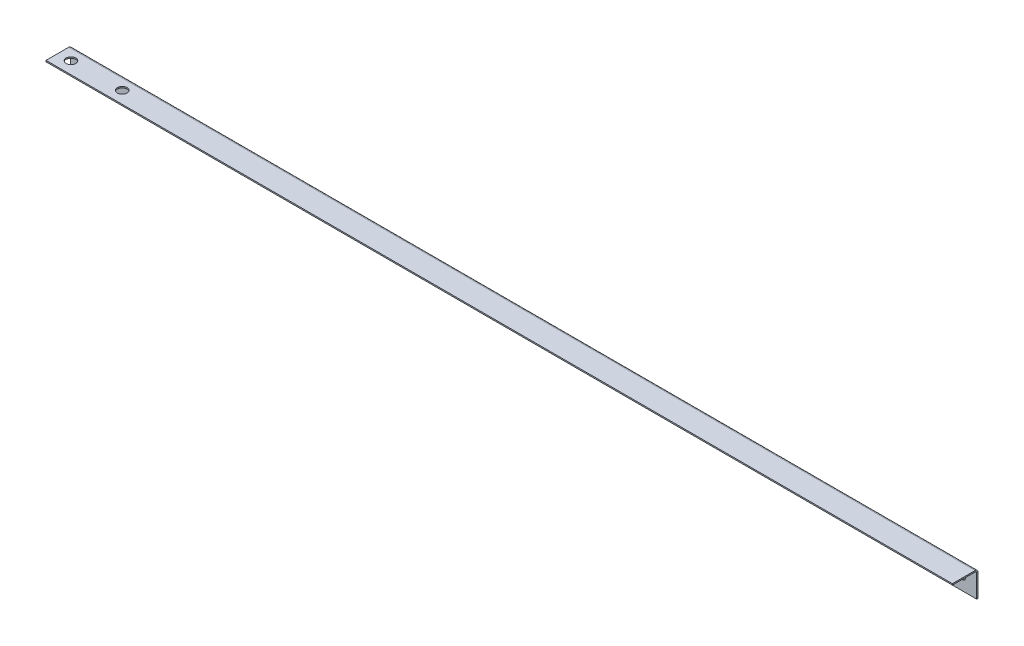
ISO-10303-21;
HEADER;
FILE_DESCRIPTION(('STEP AP214'),'2;1');
FILE_NAME('part.step','',(''),(''),'','','');
FILE_SCHEMA(('AUTOMOTIVE_DESIGN { 1 0 10303 214 1 1 1 1 }'));
ENDSEC;
DATA;
#1=APPLICATION_CONTEXT('core data for automotive mechanical design processes');
#2=APPLICATION_PROTOCOL_DEFINITION('international standard','automotive_design',2000,#1);
#3=PRODUCT_CONTEXT('',#1,'mechanical');
#4=PRODUCT('Part','Part','',(#3));
#5=PRODUCT_RELATED_PRODUCT_CATEGORY('part','',(#4));
#6=PRODUCT_DEFINITION_FORMATION('','',#4);
#7=PRODUCT_DEFINITION_CONTEXT('part definition',#1,'design');
#8=PRODUCT_DEFINITION('design','',#6,#7);
#9=PRODUCT_DEFINITION_SHAPE('','',#8);
#10=(LENGTH_UNIT() NAMED_UNIT(*) SI_UNIT(.MILLI.,.METRE.));
#11=(NAMED_UNIT(*) PLANE_ANGLE_UNIT() SI_UNIT($,.RADIAN.));
#12=(NAMED_UNIT(*) SI_UNIT($,.STERADIAN.) SOLID_ANGLE_UNIT());
#13=UNCERTAINTY_MEASURE_WITH_UNIT(LENGTH_MEASURE(1.E-05),#10,'distance_accuracy_value','');
#14=(GEOMETRIC_REPRESENTATION_CONTEXT(3) GLOBAL_UNCERTAINTY_ASSIGNED_CONTEXT((#13)) GLOBAL_UNIT_ASSIGNED_CONTEXT((#10,
#11,#12)) REPRESENTATION_CONTEXT('',''));
#15=CARTESIAN_POINT('',(0.,0.,0.));
#16=DIRECTION('',(0.,0.,1.));
#17=DIRECTION('',(1.,0.,0.));
#18=AXIS2_PLACEMENT_3D('',#15,#16,#17);
#19=CARTESIAN_POINT('',(-917.944287729196,82.8577402699222,-2.));
#20=DIRECTION('',(-1.,0.,0.));
#21=DIRECTION('',(0.,0.,1.));
#22=AXIS2_PLACEMENT_3D('',#19,#20,#21);
#23=PLANE('',#22);
#24=DIRECTION('',(0.,-1.,0.));
#25=VECTOR('',#24,1.);
#26=CARTESIAN_POINT('',(-917.944287729196,82.8577402699222,0.));
#27=LINE('',#26,#25);
#28=CARTESIAN_POINT('',(-917.944287729196,78.3577402699223,0.));
#29=VERTEX_POINT('',#28);
#30=CARTESIAN_POINT('',(-917.944287729196,42.8577402699222,0.));
#31=VERTEX_POINT('',#30);
#32=EDGE_CURVE('E311',#29,#31,#27,.T.);
#33=ORIENTED_EDGE('',*,*,#32,.F.);
#34=DIRECTION('',(0.,0.,-1.));
#35=VECTOR('',#34,1.);
#36=CARTESIAN_POINT('',(-917.944287729196,78.3577402699223,0.));
#37=LINE('',#36,#35);
#38=CARTESIAN_POINT('',(-917.944287729196,78.3577402699222,-1.99999999999999));
#39=VERTEX_POINT('',#38);
#40=EDGE_CURVE('E227',#29,#39,#37,.T.);
#41=ORIENTED_EDGE('',*,*,#40,.T.);
#42=DIRECTION('',(0.,-1.,0.));
#43=VECTOR('',#42,1.);
#44=CARTESIAN_POINT('',(-917.944287729196,82.8577402699222,-2.));
#45=LINE('',#44,#43);
#46=CARTESIAN_POINT('',(-917.944287729196,42.8577402699222,-2.));
#47=VERTEX_POINT('',#46);
#48=EDGE_CURVE('E303',#39,#47,#45,.T.);
#49=ORIENTED_EDGE('',*,*,#48,.T.);
#50=DIRECTION('',(0.,0.,1.));
#51=VECTOR('',#50,1.);
#52=CARTESIAN_POINT('',(-917.944287729196,42.8577402699222,-2.));
#53=LINE('',#52,#51);
#54=EDGE_CURVE('E65',#47,#31,#53,.T.);
#55=ORIENTED_EDGE('',*,*,#54,.T.);
#56=EDGE_LOOP('',(#33,#41,#49,#55));
#57=FACE_BOUND('',#56,.T.);
#58=ADVANCED_FACE('F61',(#57),#23,.T.);
#59=CARTESIAN_POINT('',(0.,0.,-2.));
#60=DIRECTION('',(0.,0.,-1.));
#61=DIRECTION('',(-1.,0.,0.));
#62=AXIS2_PLACEMENT_3D('',#59,#60,#61);
#63=PLANE('',#62);
#64=CARTESIAN_POINT('',(374.555712270804,62.8577402699224,-2.));
#65=DIRECTION('',(0.,0.,1.));
#66=DIRECTION('',(1.,0.,0.));
#67=AXIS2_PLACEMENT_3D('',#64,#65,#66);
#68=CIRCLE('',#67,4.99999999999999);
#69=CARTESIAN_POINT('',(374.555712270804,57.8577402699224,-2.));
#70=VERTEX_POINT('',#69);
#71=CARTESIAN_POINT('',(374.555712270804,67.8577402699224,-2.));
#72=VERTEX_POINT('',#71);
#73=EDGE_CURVE('E238',#70,#72,#68,.T.);
#74=ORIENTED_EDGE('',*,*,#73,.T.);
#75=DIRECTION('',(-1.,0.,0.));
#76=VECTOR('',#75,1.);
#77=CARTESIAN_POINT('',(374.555712270804,67.8577402699224,-2.));
#78=LINE('',#77,#76);
#79=CARTESIAN_POINT('',(359.555712270804,67.8577402699224,-2.));
#80=VERTEX_POINT('',#79);
#81=EDGE_CURVE('E241',#72,#80,#78,.T.);
#82=ORIENTED_EDGE('',*,*,#81,.T.);
#83=CARTESIAN_POINT('',(359.555712270804,62.8577402699224,-2.));
#84=DIRECTION('',(0.,0.,1.));
#85=DIRECTION('',(1.,0.,0.));
#86=AXIS2_PLACEMENT_3D('',#83,#84,#85);
#87=CIRCLE('',#86,5.);
#88=CARTESIAN_POINT('',(359.555712270804,57.8577402699224,-2.));
#89=VERTEX_POINT('',#88);
#90=EDGE_CURVE('E84',#80,#89,#87,.T.);
#91=ORIENTED_EDGE('',*,*,#90,.T.);
#92=DIRECTION('',(1.,0.,0.));
#93=VECTOR('',#92,1.);
#94=CARTESIAN_POINT('',(374.555712270804,57.8577402699224,-2.));
#95=LINE('',#94,#93);
#96=EDGE_CURVE('E246',#89,#70,#95,.T.);
#97=ORIENTED_EDGE('',*,*,#96,.T.);
#98=EDGE_LOOP('',(#74,#82,#91,#97));
#99=FACE_BOUND('',#98,.T.);
#100=CARTESIAN_POINT('',(474.555712270804,62.8577402699224,-2.));
#101=DIRECTION('',(0.,0.,1.));
#102=DIRECTION('',(1.,0.,0.));
#103=AXIS2_PLACEMENT_3D('',#100,#101,#102);
#104=CIRCLE('',#103,5.);
#105=CARTESIAN_POINT('',(474.555712270804,57.8577402699224,-2.));
#106=VERTEX_POINT('',#105);
#107=CARTESIAN_POINT('',(474.555712270804,67.8577402699224,-2.));
#108=VERTEX_POINT('',#107);
#109=EDGE_CURVE('E268',#106,#108,#104,.T.);
#110=ORIENTED_EDGE('',*,*,#109,.T.);
#111=DIRECTION('',(-1.,0.,0.));
#112=VECTOR('',#111,1.);
#113=CARTESIAN_POINT('',(474.555712270804,67.8577402699224,-2.));
#114=LINE('',#113,#112);
#115=CARTESIAN_POINT('',(459.555712270804,67.8577402699224,-2.));
#116=VERTEX_POINT('',#115);
#117=EDGE_CURVE('E271',#108,#116,#114,.T.);
#118=ORIENTED_EDGE('',*,*,#117,.T.);
#119=CARTESIAN_POINT('',(459.555712270804,62.8577402699224,-2.));
#120=DIRECTION('',(0.,0.,1.));
#121=DIRECTION('',(1.,0.,0.));
#122=AXIS2_PLACEMENT_3D('',#119,#120,#121);
#123=CIRCLE('',#122,5.);
#124=CARTESIAN_POINT('',(459.555712270804,57.8577402699224,-2.));
#125=VERTEX_POINT('',#124);
#126=EDGE_CURVE('E275',#116,#125,#123,.T.);
#127=ORIENTED_EDGE('',*,*,#126,.T.);
#128=DIRECTION('',(1.,0.,0.));
#129=VECTOR('',#128,1.);
#130=CARTESIAN_POINT('',(474.555712270804,57.8577402699224,-2.));
#131=LINE('',#130,#129);
#132=EDGE_CURVE('E278',#125,#106,#131,.T.);
#133=ORIENTED_EDGE('',*,*,#132,.T.);
#134=EDGE_LOOP('',(#110,#118,#127,#133));
#135=FACE_BOUND('',#134,.T.);
#136=ORIENTED_EDGE('',*,*,#48,.F.);
#137=DIRECTION('',(-1.,0.,0.));
#138=VECTOR('',#137,1.);
#139=CARTESIAN_POINT('',(-917.944287729196,78.3577402699222,-1.99999999999999));
#140=LINE('',#139,#138);
#141=CARTESIAN_POINT('',(497.055712270804,78.3577402699223,-2.));
#142=VERTEX_POINT('',#141);
#143=EDGE_CURVE('E177',#39,#142,#140,.F.);
#144=ORIENTED_EDGE('',*,*,#143,.T.);
#145=DIRECTION('',(0.,1.,0.));
#146=VECTOR('',#145,1.);
#147=CARTESIAN_POINT('',(497.055712270804,82.8577402699224,-2.));
#148=LINE('',#147,#146);
#149=CARTESIAN_POINT('',(497.055712270804,42.8577402699224,-2.));
#150=VERTEX_POINT('',#149);
#151=EDGE_CURVE('E300',#150,#142,#148,.T.);
#152=ORIENTED_EDGE('',*,*,#151,.F.);
#153=DIRECTION('',(1.,0.,0.));
#154=VECTOR('',#153,1.);
#155=CARTESIAN_POINT('',(497.055712270804,42.8577402699224,-2.));
#156=LINE('',#155,#154);
#157=EDGE_CURVE('E306',#47,#150,#156,.T.);
#158=ORIENTED_EDGE('',*,*,#157,.F.);
#159=EDGE_LOOP('',(#136,#144,#152,#158));
#160=FACE_BOUND('',#159,.T.);
#161=ADVANCED_FACE('F333',(#99,#135,#160),#63,.T.);
#162=CARTESIAN_POINT('',(0.,0.,0.));
#163=DIRECTION('',(0.,0.,-1.));
#164=DIRECTION('',(-1.,0.,0.));
#165=AXIS2_PLACEMENT_3D('',#162,#163,#164);
#166=PLANE('',#165);
#167=DIRECTION('',(-1.,0.,0.));
#168=VECTOR('',#167,1.);
#169=CARTESIAN_POINT('',(474.555712270804,67.8577402699224,0.));
#170=LINE('',#169,#168);
#171=CARTESIAN_POINT('',(474.555712270804,67.8577402699224,0.));
#172=VERTEX_POINT('',#171);
#173=CARTESIAN_POINT('',(459.555712270804,67.8577402699224,0.));
#174=VERTEX_POINT('',#173);
#175=EDGE_CURVE('E283',#172,#174,#170,.T.);
#176=ORIENTED_EDGE('',*,*,#175,.F.);
#177=CARTESIAN_POINT('',(474.555712270804,62.8577402699224,0.));
#178=DIRECTION('',(0.,0.,1.));
#179=DIRECTION('',(1.,0.,0.));
#180=AXIS2_PLACEMENT_3D('',#177,#178,#179);
#181=CIRCLE('',#180,5.);
#182=CARTESIAN_POINT('',(474.555712270804,57.8577402699224,0.));
#183=VERTEX_POINT('',#182);
#184=EDGE_CURVE('E261',#183,#172,#181,.T.);
#185=ORIENTED_EDGE('',*,*,#184,.F.);
#186=DIRECTION('',(1.,0.,0.));
#187=VECTOR('',#186,1.);
#188=CARTESIAN_POINT('',(474.555712270804,57.8577402699224,0.));
#189=LINE('',#188,#187);
#190=CARTESIAN_POINT('',(459.555712270804,57.8577402699224,0.));
#191=VERTEX_POINT('',#190);
#192=EDGE_CURVE('E272',#191,#183,#189,.T.);
#193=ORIENTED_EDGE('',*,*,#192,.F.);
#194=CARTESIAN_POINT('',(459.555712270804,62.8577402699224,0.));
#195=DIRECTION('',(0.,0.,1.));
#196=DIRECTION('',(1.,0.,0.));
#197=AXIS2_PLACEMENT_3D('',#194,#195,#196);
#198=CIRCLE('',#197,5.);
#199=EDGE_CURVE('E286',#174,#191,#198,.T.);
#200=ORIENTED_EDGE('',*,*,#199,.F.);
#201=EDGE_LOOP('',(#176,#185,#193,#200));
#202=FACE_BOUND('',#201,.T.);
#203=DIRECTION('',(-1.,0.,0.));
#204=VECTOR('',#203,1.);
#205=CARTESIAN_POINT('',(374.555712270804,67.8577402699224,0.));
#206=LINE('',#205,#204);
#207=CARTESIAN_POINT('',(374.555712270804,67.8577402699224,0.));
#208=VERTEX_POINT('',#207);
#209=CARTESIAN_POINT('',(359.555712270804,67.8577402699224,0.));
#210=VERTEX_POINT('',#209);
#211=EDGE_CURVE('E251',#208,#210,#206,.T.);
#212=ORIENTED_EDGE('',*,*,#211,.F.);
#213=CARTESIAN_POINT('',(374.555712270804,62.8577402699224,0.));
#214=DIRECTION('',(0.,0.,1.));
#215=DIRECTION('',(1.,0.,0.));
#216=AXIS2_PLACEMENT_3D('',#213,#214,#215);
#217=CIRCLE('',#216,4.99999999999999);
#218=CARTESIAN_POINT('',(374.555712270804,57.8577402699224,0.));
#219=VERTEX_POINT('',#218);
#220=EDGE_CURVE('E236',#219,#208,#217,.T.);
#221=ORIENTED_EDGE('',*,*,#220,.F.);
#222=DIRECTION('',(1.,0.,0.));
#223=VECTOR('',#222,1.);
#224=CARTESIAN_POINT('',(374.555712270804,57.8577402699224,0.));
#225=LINE('',#224,#223);
#226=CARTESIAN_POINT('',(359.555712270804,57.8577402699224,0.));
#227=VERTEX_POINT('',#226);
#228=EDGE_CURVE('E242',#227,#219,#225,.T.);
#229=ORIENTED_EDGE('',*,*,#228,.F.);
#230=CARTESIAN_POINT('',(359.555712270804,62.8577402699224,0.));
#231=DIRECTION('',(0.,0.,1.));
#232=DIRECTION('',(1.,0.,0.));
#233=AXIS2_PLACEMENT_3D('',#230,#231,#232);
#234=CIRCLE('',#233,5.);
#235=EDGE_CURVE('E254',#210,#227,#234,.T.);
#236=ORIENTED_EDGE('',*,*,#235,.F.);
#237=EDGE_LOOP('',(#212,#221,#229,#236));
#238=FACE_BOUND('',#237,.T.);
#239=DIRECTION('',(-1.,0.,0.));
#240=VECTOR('',#239,1.);
#241=CARTESIAN_POINT('',(-917.944287729196,78.3577402699223,0.));
#242=LINE('',#241,#240);
#243=CARTESIAN_POINT('',(497.055712270804,78.3577402699223,-1.14491749414469E-13));
#244=VERTEX_POINT('',#243);
#245=EDGE_CURVE('E231',#29,#244,#242,.F.);
#246=ORIENTED_EDGE('',*,*,#245,.F.);
#247=ORIENTED_EDGE('',*,*,#32,.T.);
#248=DIRECTION('',(1.,0.,0.));
#249=VECTOR('',#248,1.);
#250=CARTESIAN_POINT('',(497.055712270804,42.8577402699224,0.));
#251=LINE('',#250,#249);
#252=CARTESIAN_POINT('',(497.055712270804,42.8577402699224,0.));
#253=VERTEX_POINT('',#252);
#254=EDGE_CURVE('E304',#31,#253,#251,.T.);
#255=ORIENTED_EDGE('',*,*,#254,.T.);
#256=DIRECTION('',(0.,1.,0.));
#257=VECTOR('',#256,1.);
#258=CARTESIAN_POINT('',(497.055712270804,82.8577402699224,0.));
#259=LINE('',#258,#257);
#260=EDGE_CURVE('E293',#253,#244,#259,.T.);
#261=ORIENTED_EDGE('',*,*,#260,.T.);
#262=EDGE_LOOP('',(#246,#247,#255,#261));
#263=FACE_BOUND('',#262,.T.);
#264=ADVANCED_FACE('F317',(#202,#238,#263),#166,.F.);
#265=CARTESIAN_POINT('',(497.055712270804,82.8577402699224,-2.));
#266=DIRECTION('',(1.,0.,0.));
#267=DIRECTION('',(0.,0.,-1.));
#268=AXIS2_PLACEMENT_3D('',#265,#266,#267);
#269=PLANE('',#268);
#270=DIRECTION('',(0.,0.,-1.));
#271=VECTOR('',#270,1.);
#272=CARTESIAN_POINT('',(497.055712270804,78.3577402699223,-1.14491749414469E-13));
#273=LINE('',#272,#271);
#274=EDGE_CURVE('E234',#244,#142,#273,.T.);
#275=ORIENTED_EDGE('',*,*,#274,.F.);
#276=ORIENTED_EDGE('',*,*,#260,.F.);
#277=DIRECTION('',(0.,0.,1.));
#278=VECTOR('',#277,1.);
#279=CARTESIAN_POINT('',(497.055712270804,42.8577402699224,-2.));
#280=LINE('',#279,#278);
#281=EDGE_CURVE('E13',#150,#253,#280,.T.);
#282=ORIENTED_EDGE('',*,*,#281,.F.);
#283=ORIENTED_EDGE('',*,*,#151,.T.);
#284=EDGE_LOOP('',(#275,#276,#282,#283));
#285=FACE_BOUND('',#284,.T.);
#286=ADVANCED_FACE('F63',(#285),#269,.T.);
#287=CARTESIAN_POINT('',(497.055712270804,42.8577402699224,-2.));
#288=DIRECTION('',(0.,-1.,0.));
#289=DIRECTION('',(1.,0.,0.));
#290=AXIS2_PLACEMENT_3D('',#287,#288,#289);
#291=PLANE('',#290);
#292=ORIENTED_EDGE('',*,*,#254,.F.);
#293=ORIENTED_EDGE('',*,*,#54,.F.);
#294=ORIENTED_EDGE('',*,*,#157,.T.);
#295=ORIENTED_EDGE('',*,*,#281,.T.);
#296=EDGE_LOOP('',(#292,#293,#294,#295));
#297=FACE_BOUND('',#296,.T.);
#298=ADVANCED_FACE('F324',(#297),#291,.T.);
#299=CARTESIAN_POINT('',(474.555712270804,62.8577402699224,-2.));
#300=DIRECTION('',(0.,0.,1.));
#301=DIRECTION('',(1.,0.,0.));
#302=AXIS2_PLACEMENT_3D('',#299,#300,#301);
#303=CYLINDRICAL_SURFACE('',#302,5.);
#304=ORIENTED_EDGE('',*,*,#184,.T.);
#305=DIRECTION('',(0.,0.,1.));
#306=VECTOR('',#305,1.);
#307=CARTESIAN_POINT('',(474.555712270804,67.8577402699224,-2.));
#308=LINE('',#307,#306);
#309=EDGE_CURVE('E281',#108,#172,#308,.T.);
#310=ORIENTED_EDGE('',*,*,#309,.F.);
#311=ORIENTED_EDGE('',*,*,#109,.F.);
#312=DIRECTION('',(0.,0.,1.));
#313=VECTOR('',#312,1.);
#314=CARTESIAN_POINT('',(474.555712270804,57.8577402699224,-2.));
#315=LINE('',#314,#313);
#316=EDGE_CURVE('E291',#106,#183,#315,.T.);
#317=ORIENTED_EDGE('',*,*,#316,.T.);
#318=EDGE_LOOP('',(#304,#310,#311,#317));
#319=FACE_BOUND('',#318,.T.);
#320=ADVANCED_FACE('F392',(#319),#303,.F.);
#321=CARTESIAN_POINT('',(474.555712270804,57.8577402699224,-2.));
#322=DIRECTION('',(0.,-1.,0.));
#323=DIRECTION('',(1.,0.,0.));
#324=AXIS2_PLACEMENT_3D('',#321,#322,#323);
#325=PLANE('',#324);
#326=ORIENTED_EDGE('',*,*,#192,.T.);
#327=ORIENTED_EDGE('',*,*,#316,.F.);
#328=ORIENTED_EDGE('',*,*,#132,.F.);
#329=DIRECTION('',(0.,0.,1.));
#330=VECTOR('',#329,1.);
#331=CARTESIAN_POINT('',(459.555712270804,57.8577402699224,-2.));
#332=LINE('',#331,#330);
#333=EDGE_CURVE('E294',#125,#191,#332,.T.);
#334=ORIENTED_EDGE('',*,*,#333,.T.);
#335=EDGE_LOOP('',(#326,#327,#328,#334));
#336=FACE_BOUND('',#335,.T.);
#337=ADVANCED_FACE('F398',(#336),#325,.F.);
#338=CARTESIAN_POINT('',(459.555712270804,62.8577402699224,-2.));
#339=DIRECTION('',(0.,0.,1.));
#340=DIRECTION('',(1.,0.,0.));
#341=AXIS2_PLACEMENT_3D('',#338,#339,#340);
#342=CYLINDRICAL_SURFACE('',#341,5.);
#343=ORIENTED_EDGE('',*,*,#199,.T.);
#344=ORIENTED_EDGE('',*,*,#333,.F.);
#345=ORIENTED_EDGE('',*,*,#126,.F.);
#346=DIRECTION('',(0.,0.,1.));
#347=VECTOR('',#346,1.);
#348=CARTESIAN_POINT('',(459.555712270804,67.8577402699224,-2.));
#349=LINE('',#348,#347);
#350=EDGE_CURVE('E296',#116,#174,#349,.T.);
#351=ORIENTED_EDGE('',*,*,#350,.T.);
#352=EDGE_LOOP('',(#343,#344,#345,#351));
#353=FACE_BOUND('',#352,.T.);
#354=ADVANCED_FACE('F404',(#353),#342,.F.);
#355=CARTESIAN_POINT('',(474.555712270804,67.8577402699224,-2.));
#356=DIRECTION('',(0.,1.,0.));
#357=DIRECTION('',(0.,0.,1.));
#358=AXIS2_PLACEMENT_3D('',#355,#356,#357);
#359=PLANE('',#358);
#360=ORIENTED_EDGE('',*,*,#175,.T.);
#361=ORIENTED_EDGE('',*,*,#350,.F.);
#362=ORIENTED_EDGE('',*,*,#117,.F.);
#363=ORIENTED_EDGE('',*,*,#309,.T.);
#364=EDGE_LOOP('',(#360,#361,#362,#363));
#365=FACE_BOUND('',#364,.T.);
#366=ADVANCED_FACE('F400',(#365),#359,.F.);
#367=CARTESIAN_POINT('',(374.555712270804,62.8577402699224,-2.));
#368=DIRECTION('',(0.,0.,1.));
#369=DIRECTION('',(1.,0.,0.));
#370=AXIS2_PLACEMENT_3D('',#367,#368,#369);
#371=CYLINDRICAL_SURFACE('',#370,4.99999999999999);
#372=ORIENTED_EDGE('',*,*,#220,.T.);
#373=DIRECTION('',(0.,0.,1.));
#374=VECTOR('',#373,1.);
#375=CARTESIAN_POINT('',(374.555712270804,67.8577402699224,-2.));
#376=LINE('',#375,#374);
#377=EDGE_CURVE('E249',#72,#208,#376,.T.);
#378=ORIENTED_EDGE('',*,*,#377,.F.);
#379=ORIENTED_EDGE('',*,*,#73,.F.);
#380=DIRECTION('',(0.,0.,1.));
#381=VECTOR('',#380,1.);
#382=CARTESIAN_POINT('',(374.555712270804,57.8577402699224,-2.));
#383=LINE('',#382,#381);
#384=EDGE_CURVE('E259',#70,#219,#383,.T.);
#385=ORIENTED_EDGE('',*,*,#384,.T.);
#386=EDGE_LOOP('',(#372,#378,#379,#385));
#387=FACE_BOUND('',#386,.T.);
#388=ADVANCED_FACE('F403',(#387),#371,.F.);
#389=CARTESIAN_POINT('',(374.555712270804,57.8577402699224,-2.));
#390=DIRECTION('',(0.,-1.,0.));
#391=DIRECTION('',(1.,0.,0.));
#392=AXIS2_PLACEMENT_3D('',#389,#390,#391);
#393=PLANE('',#392);
#394=ORIENTED_EDGE('',*,*,#228,.T.);
#395=ORIENTED_EDGE('',*,*,#384,.F.);
#396=ORIENTED_EDGE('',*,*,#96,.F.);
#397=DIRECTION('',(0.,0.,1.));
#398=VECTOR('',#397,1.);
#399=CARTESIAN_POINT('',(359.555712270804,57.8577402699224,-2.));
#400=LINE('',#399,#398);
#401=EDGE_CURVE('E262',#89,#227,#400,.T.);
#402=ORIENTED_EDGE('',*,*,#401,.T.);
#403=EDGE_LOOP('',(#394,#395,#396,#402));
#404=FACE_BOUND('',#403,.T.);
#405=ADVANCED_FACE('F414',(#404),#393,.F.);
#406=CARTESIAN_POINT('',(359.555712270804,62.8577402699224,-2.));
#407=DIRECTION('',(0.,0.,1.));
#408=DIRECTION('',(1.,0.,0.));
#409=AXIS2_PLACEMENT_3D('',#406,#407,#408);
#410=CYLINDRICAL_SURFACE('',#409,5.);
#411=ORIENTED_EDGE('',*,*,#235,.T.);
#412=ORIENTED_EDGE('',*,*,#401,.F.);
#413=ORIENTED_EDGE('',*,*,#90,.F.);
#414=DIRECTION('',(0.,0.,1.));
#415=VECTOR('',#414,1.);
#416=CARTESIAN_POINT('',(359.555712270804,67.8577402699224,-2.));
#417=LINE('',#416,#415);
#418=EDGE_CURVE('E264',#80,#210,#417,.T.);
#419=ORIENTED_EDGE('',*,*,#418,.T.);
#420=EDGE_LOOP('',(#411,#412,#413,#419));
#421=FACE_BOUND('',#420,.T.);
#422=ADVANCED_FACE('F419',(#421),#410,.F.);
#423=CARTESIAN_POINT('',(374.555712270804,67.8577402699224,-2.));
#424=DIRECTION('',(0.,1.,0.));
#425=DIRECTION('',(0.,0.,1.));
#426=AXIS2_PLACEMENT_3D('',#423,#424,#425);
#427=PLANE('',#426);
#428=ORIENTED_EDGE('',*,*,#211,.T.);
#429=ORIENTED_EDGE('',*,*,#418,.F.);
#430=ORIENTED_EDGE('',*,*,#81,.F.);
#431=ORIENTED_EDGE('',*,*,#377,.T.);
#432=EDGE_LOOP('',(#428,#429,#430,#431));
#433=FACE_BOUND('',#432,.T.);
#434=ADVANCED_FACE('F416',(#433),#427,.F.);
#435=CARTESIAN_POINT('',(497.055712270804,78.3577402699223,2.49999999999997));
#436=DIRECTION('',(1.,0.,0.));
#437=DIRECTION('',(0.,0.,-1.));
#438=AXIS2_PLACEMENT_3D('',#435,#436,#437);
#439=PLANE('',#438);
#440=DIRECTION('',(0.,1.,0.));
#441=VECTOR('',#440,1.);
#442=CARTESIAN_POINT('',(497.055712270804,82.8577402699224,2.49999999999998));
#443=LINE('',#442,#441);
#444=CARTESIAN_POINT('',(497.055712270804,80.8577402699224,2.49999999999996));
#445=VERTEX_POINT('',#444);
#446=CARTESIAN_POINT('',(497.055712270804,82.8577402699224,2.49999999999995));
#447=VERTEX_POINT('',#446);
#448=EDGE_CURVE('E222',#445,#447,#443,.T.);
#449=ORIENTED_EDGE('',*,*,#448,.F.);
#450=CARTESIAN_POINT('',(497.055712270804,78.3577402699223,2.49999999999997));
#451=DIRECTION('',(-1.,0.,0.));
#452=DIRECTION('',(0.,0.,1.));
#453=AXIS2_PLACEMENT_3D('',#450,#451,#452);
#454=CIRCLE('',#453,2.50000000000009);
#455=EDGE_CURVE('E180',#244,#445,#454,.F.);
#456=ORIENTED_EDGE('',*,*,#455,.F.);
#457=ORIENTED_EDGE('',*,*,#274,.T.);
#458=CARTESIAN_POINT('',(497.055712270804,78.3577402699223,2.49999999999997));
#459=DIRECTION('',(-1.,0.,0.));
#460=DIRECTION('',(0.,0.,1.));
#461=AXIS2_PLACEMENT_3D('',#458,#459,#460);
#462=CIRCLE('',#461,4.50000000000009);
#463=EDGE_CURVE('E76',#142,#447,#462,.F.);
#464=ORIENTED_EDGE('',*,*,#463,.T.);
#465=EDGE_LOOP('',(#449,#456,#457,#464));
#466=FACE_BOUND('',#465,.T.);
#467=ADVANCED_FACE('F330',(#466),#439,.T.);
#468=CARTESIAN_POINT('',(-917.944287729196,78.3577402699223,2.50000000000009));
#469=DIRECTION('',(1.,0.,0.));
#470=DIRECTION('',(0.,0.,-1.));
#471=AXIS2_PLACEMENT_3D('',#468,#469,#470);
#472=PLANE('',#471);
#473=CARTESIAN_POINT('',(-917.944287729196,78.3577402699223,2.50000000000009));
#474=DIRECTION('',(-1.,0.,0.));
#475=DIRECTION('',(0.,0.,1.));
#476=AXIS2_PLACEMENT_3D('',#473,#474,#475);
#477=CIRCLE('',#476,2.50000000000009);
#478=CARTESIAN_POINT('',(-917.944287729196,80.8577402699224,2.50000000000008));
#479=VERTEX_POINT('',#478);
#480=EDGE_CURVE('E187',#479,#29,#477,.T.);
#481=ORIENTED_EDGE('',*,*,#480,.F.);
#482=DIRECTION('',(0.,1.,0.));
#483=VECTOR('',#482,1.);
#484=CARTESIAN_POINT('',(-917.944287729196,80.8577402699223,2.50000000000006));
#485=LINE('',#484,#483);
#486=CARTESIAN_POINT('',(-917.944287729196,82.8577402699223,2.50000000000005));
#487=VERTEX_POINT('',#486);
#488=EDGE_CURVE('E184',#479,#487,#485,.T.);
#489=ORIENTED_EDGE('',*,*,#488,.T.);
#490=CARTESIAN_POINT('',(-917.944287729196,78.3577402699223,2.50000000000009));
#491=DIRECTION('',(-1.,0.,0.));
#492=DIRECTION('',(0.,0.,1.));
#493=AXIS2_PLACEMENT_3D('',#490,#491,#492);
#494=CIRCLE('',#493,4.50000000000009);
#495=EDGE_CURVE('E171',#487,#39,#494,.T.);
#496=ORIENTED_EDGE('',*,*,#495,.T.);
#497=ORIENTED_EDGE('',*,*,#40,.F.);
#498=EDGE_LOOP('',(#481,#489,#496,#497));
#499=FACE_BOUND('',#498,.T.);
#500=ADVANCED_FACE('F185',(#499),#472,.F.);
#501=CARTESIAN_POINT('',(-917.944287729196,78.3577402699223,2.50000000000009));
#502=DIRECTION('',(-1.,0.,0.));
#503=DIRECTION('',(0.,1.,0.));
#504=AXIS2_PLACEMENT_3D('',#501,#502,#503);
#505=CYLINDRICAL_SURFACE('',#504,4.50000000000009);
#506=ORIENTED_EDGE('',*,*,#143,.F.);
#507=ORIENTED_EDGE('',*,*,#495,.F.);
#508=DIRECTION('',(-1.,0.,0.));
#509=VECTOR('',#508,1.);
#510=CARTESIAN_POINT('',(0.,82.8577402699224,2.50000000000001));
#511=LINE('',#510,#509);
#512=EDGE_CURVE('E175',#447,#487,#511,.T.);
#513=ORIENTED_EDGE('',*,*,#512,.F.);
#514=ORIENTED_EDGE('',*,*,#463,.F.);
#515=EDGE_LOOP('',(#506,#507,#513,#514));
#516=FACE_BOUND('',#515,.T.);
#517=ADVANCED_FACE('F173',(#516),#505,.T.);
#518=CARTESIAN_POINT('',(-917.944287729196,78.3577402699223,2.50000000000009));
#519=DIRECTION('',(-1.,0.,0.));
#520=DIRECTION('',(0.,1.,0.));
#521=AXIS2_PLACEMENT_3D('',#518,#519,#520);
#522=CYLINDRICAL_SURFACE('',#521,2.50000000000009);
#523=ORIENTED_EDGE('',*,*,#245,.T.);
#524=ORIENTED_EDGE('',*,*,#455,.T.);
#525=DIRECTION('',(1.,0.,0.));
#526=VECTOR('',#525,1.);
#527=CARTESIAN_POINT('',(497.055712270804,80.8577402699224,2.49999999999999));
#528=LINE('',#527,#526);
#529=EDGE_CURVE('E192',#445,#479,#528,.F.);
#530=ORIENTED_EDGE('',*,*,#529,.T.);
#531=ORIENTED_EDGE('',*,*,#480,.T.);
#532=EDGE_LOOP('',(#523,#524,#530,#531));
#533=FACE_BOUND('',#532,.T.);
#534=ADVANCED_FACE('F336',(#533),#522,.F.);
#535=CARTESIAN_POINT('',(-917.944287729196,82.8577402699222,0.));
#536=DIRECTION('',(-1.,0.,0.));
#537=DIRECTION('',(0.,-1.,0.));
#538=AXIS2_PLACEMENT_3D('',#535,#536,#537);
#539=PLANE('',#538);
#540=DIRECTION('',(0.,0.,-1.));
#541=VECTOR('',#540,1.);
#542=CARTESIAN_POINT('',(-917.944287729196,82.8577402699222,0.));
#543=LINE('',#542,#541);
#544=CARTESIAN_POINT('',(-917.944287729196,82.8577402699224,38.));
#545=VERTEX_POINT('',#544);
#546=EDGE_CURVE('E199',#545,#487,#543,.T.);
#547=ORIENTED_EDGE('',*,*,#546,.T.);
#548=ORIENTED_EDGE('',*,*,#488,.F.);
#549=DIRECTION('',(0.,0.,1.));
#550=VECTOR('',#549,1.);
#551=CARTESIAN_POINT('',(-917.944287729196,80.8577402699222,-3.02600562552891E-13));
#552=LINE('',#551,#550);
#553=CARTESIAN_POINT('',(-917.944287729196,80.8577402699224,38.));
#554=VERTEX_POINT('',#553);
#555=EDGE_CURVE('E215',#554,#479,#552,.F.);
#556=ORIENTED_EDGE('',*,*,#555,.F.);
#557=DIRECTION('',(0.,-1.,0.));
#558=VECTOR('',#557,1.);
#559=CARTESIAN_POINT('',(-917.944287729196,82.8577402699224,38.));
#560=LINE('',#559,#558);
#561=EDGE_CURVE('E204',#545,#554,#560,.T.);
#562=ORIENTED_EDGE('',*,*,#561,.F.);
#563=EDGE_LOOP('',(#547,#548,#556,#562));
#564=FACE_BOUND('',#563,.T.);
#565=ADVANCED_FACE('F203',(#564),#539,.T.);
#566=CARTESIAN_POINT('',(497.055712270804,82.8577402699226,38.));
#567=DIRECTION('',(1.,0.,0.));
#568=DIRECTION('',(0.,1.,0.));
#569=AXIS2_PLACEMENT_3D('',#566,#567,#568);
#570=PLANE('',#569);
#571=DIRECTION('',(0.,0.,-1.));
#572=VECTOR('',#571,1.);
#573=CARTESIAN_POINT('',(497.055712270804,80.8577402699224,-3.02600562552891E-13));
#574=LINE('',#573,#572);
#575=CARTESIAN_POINT('',(497.055712270804,80.8577402699226,38.));
#576=VERTEX_POINT('',#575);
#577=EDGE_CURVE('E201',#445,#576,#574,.F.);
#578=ORIENTED_EDGE('',*,*,#577,.F.);
#579=ORIENTED_EDGE('',*,*,#448,.T.);
#580=DIRECTION('',(0.,0.,1.));
#581=VECTOR('',#580,1.);
#582=CARTESIAN_POINT('',(497.055712270804,82.8577402699226,38.));
#583=LINE('',#582,#581);
#584=CARTESIAN_POINT('',(497.055712270804,82.8577402699226,38.));
#585=VERTEX_POINT('',#584);
#586=EDGE_CURVE('E200',#447,#585,#583,.T.);
#587=ORIENTED_EDGE('',*,*,#586,.T.);
#588=DIRECTION('',(0.,-1.,0.));
#589=VECTOR('',#588,1.);
#590=CARTESIAN_POINT('',(497.055712270804,82.8577402699226,38.));
#591=LINE('',#590,#589);
#592=EDGE_CURVE('E206',#585,#576,#591,.T.);
#593=ORIENTED_EDGE('',*,*,#592,.T.);
#594=EDGE_LOOP('',(#578,#579,#587,#593));
#595=FACE_BOUND('',#594,.T.);
#596=ADVANCED_FACE('F342',(#595),#570,.T.);
#597=CARTESIAN_POINT('',(0.,82.8577402699224,-3.09583525230577E-13));
#598=DIRECTION('',(0.,1.,0.));
#599=DIRECTION('',(0.,0.,1.));
#600=AXIS2_PLACEMENT_3D('',#597,#598,#599);
#601=PLANE('',#600);
#602=CARTESIAN_POINT('',(-817.944287729196,82.8577402699227,19.));
#603=DIRECTION('',(0.,-1.,0.));
#604=DIRECTION('',(0.,0.,-1.));
#605=AXIS2_PLACEMENT_3D('',#602,#603,#604);
#606=CIRCLE('',#605,7.49999999999995);
#607=CARTESIAN_POINT('',(-817.944287729196,82.8577402699226,11.5));
#608=VERTEX_POINT('',#607);
#609=EDGE_CURVE('E351',#608,#608,#606,.T.);
#610=ORIENTED_EDGE('',*,*,#609,.T.);
#611=EDGE_LOOP('',(#610));
#612=FACE_BOUND('',#611,.T.);
#613=CARTESIAN_POINT('',(-897.944287729196,82.8577402699226,19.));
#614=DIRECTION('',(0.,-1.,0.));
#615=DIRECTION('',(0.,0.,-1.));
#616=AXIS2_PLACEMENT_3D('',#613,#614,#615);
#617=CIRCLE('',#616,7.49999999999995);
#618=CARTESIAN_POINT('',(-897.944287729196,82.8577402699226,11.5));
#619=VERTEX_POINT('',#618);
#620=EDGE_CURVE('E225',#619,#619,#617,.T.);
#621=ORIENTED_EDGE('',*,*,#620,.T.);
#622=EDGE_LOOP('',(#621));
#623=FACE_BOUND('',#622,.T.);
#624=ORIENTED_EDGE('',*,*,#586,.F.);
#625=ORIENTED_EDGE('',*,*,#512,.T.);
#626=ORIENTED_EDGE('',*,*,#546,.F.);
#627=DIRECTION('',(-1.,0.,0.));
#628=VECTOR('',#627,1.);
#629=CARTESIAN_POINT('',(-917.944287729196,82.8577402699224,38.));
#630=LINE('',#629,#628);
#631=EDGE_CURVE('E207',#585,#545,#630,.T.);
#632=ORIENTED_EDGE('',*,*,#631,.F.);
#633=EDGE_LOOP('',(#624,#625,#626,#632));
#634=FACE_BOUND('',#633,.T.);
#635=ADVANCED_FACE('F197',(#612,#623,#634),#601,.T.);
#636=CARTESIAN_POINT('',(0.,80.8577402699224,-3.02600562552891E-13));
#637=DIRECTION('',(0.,1.,0.));
#638=DIRECTION('',(0.,0.,1.));
#639=AXIS2_PLACEMENT_3D('',#636,#637,#638);
#640=PLANE('',#639);
#641=CARTESIAN_POINT('',(-817.944287729196,80.8577402699223,19.));
#642=DIRECTION('',(0.,-1.,0.));
#643=DIRECTION('',(0.,0.,-1.));
#644=AXIS2_PLACEMENT_3D('',#641,#642,#643);
#645=CIRCLE('',#644,7.49999999999995);
#646=CARTESIAN_POINT('',(-817.944287729196,80.8577402699223,11.5000000000001));
#647=VERTEX_POINT('',#646);
#648=EDGE_CURVE('E354',#647,#647,#645,.T.);
#649=ORIENTED_EDGE('',*,*,#648,.F.);
#650=EDGE_LOOP('',(#649));
#651=FACE_BOUND('',#650,.T.);
#652=CARTESIAN_POINT('',(-897.944287729196,80.8577402699223,19.));
#653=DIRECTION('',(0.,-1.,0.));
#654=DIRECTION('',(0.,0.,-1.));
#655=AXIS2_PLACEMENT_3D('',#652,#653,#654);
#656=CIRCLE('',#655,7.49999999999995);
#657=CARTESIAN_POINT('',(-897.944287729196,80.8577402699223,11.5000000000001));
#658=VERTEX_POINT('',#657);
#659=EDGE_CURVE('E348',#658,#658,#656,.T.);
#660=ORIENTED_EDGE('',*,*,#659,.F.);
#661=EDGE_LOOP('',(#660));
#662=FACE_BOUND('',#661,.T.);
#663=ORIENTED_EDGE('',*,*,#529,.F.);
#664=ORIENTED_EDGE('',*,*,#577,.T.);
#665=DIRECTION('',(1.,0.,0.));
#666=VECTOR('',#665,1.);
#667=CARTESIAN_POINT('',(0.,80.8577402699225,38.));
#668=LINE('',#667,#666);
#669=EDGE_CURVE('E217',#576,#554,#668,.F.);
#670=ORIENTED_EDGE('',*,*,#669,.T.);
#671=ORIENTED_EDGE('',*,*,#555,.T.);
#672=EDGE_LOOP('',(#663,#664,#670,#671));
#673=FACE_BOUND('',#672,.T.);
#674=ADVANCED_FACE('F340',(#651,#662,#673),#640,.F.);
#675=CARTESIAN_POINT('',(-917.944287729196,82.8577402699224,38.));
#676=DIRECTION('',(0.,0.,1.));
#677=DIRECTION('',(0.,-1.,0.));
#678=AXIS2_PLACEMENT_3D('',#675,#676,#677);
#679=PLANE('',#678);
#680=ORIENTED_EDGE('',*,*,#669,.F.);
#681=ORIENTED_EDGE('',*,*,#592,.F.);
#682=ORIENTED_EDGE('',*,*,#631,.T.);
#683=ORIENTED_EDGE('',*,*,#561,.T.);
#684=EDGE_LOOP('',(#680,#681,#682,#683));
#685=FACE_BOUND('',#684,.T.);
#686=ADVANCED_FACE('F346',(#685),#679,.T.);
#687=CARTESIAN_POINT('',(-897.944287729196,82.8577402699226,19.));
#688=DIRECTION('',(0.,-1.,0.));
#689=DIRECTION('',(0.,0.,-1.));
#690=AXIS2_PLACEMENT_3D('',#687,#688,#689);
#691=CYLINDRICAL_SURFACE('',#690,7.49999999999995);
#692=ORIENTED_EDGE('',*,*,#620,.F.);
#693=EDGE_LOOP('',(#692));
#694=FACE_BOUND('',#693,.T.);
#695=ORIENTED_EDGE('',*,*,#659,.T.);
#696=EDGE_LOOP('',(#695));
#697=FACE_BOUND('',#696,.T.);
#698=ADVANCED_FACE('F365',(#694,#697),#691,.F.);
#699=CARTESIAN_POINT('',(-817.944287729196,82.8577402699227,19.));
#700=DIRECTION('',(0.,-1.,0.));
#701=DIRECTION('',(0.,0.,-1.));
#702=AXIS2_PLACEMENT_3D('',#699,#700,#701);
#703=CYLINDRICAL_SURFACE('',#702,7.49999999999995);
#704=ORIENTED_EDGE('',*,*,#609,.F.);
#705=EDGE_LOOP('',(#704));
#706=FACE_BOUND('',#705,.T.);
#707=ORIENTED_EDGE('',*,*,#648,.T.);
#708=EDGE_LOOP('',(#707));
#709=FACE_BOUND('',#708,.T.);
#710=ADVANCED_FACE('F362',(#706,#709),#703,.F.);
#711=CLOSED_SHELL('',(#58,#161,#264,#286,#298,#320,#337,#354,#366,#388,#405,#422,#434,#467,#500,
#517,#534,#565,#596,#635,#674,#686,#698,#710));
#712=MANIFOLD_SOLID_BREP('B2',#711);
#713=ADVANCED_BREP_SHAPE_REPRESENTATION('',(#18,#712),#14);
#714=SHAPE_DEFINITION_REPRESENTATION(#9,#713);
ENDSEC;
END-ISO-10303-21;
